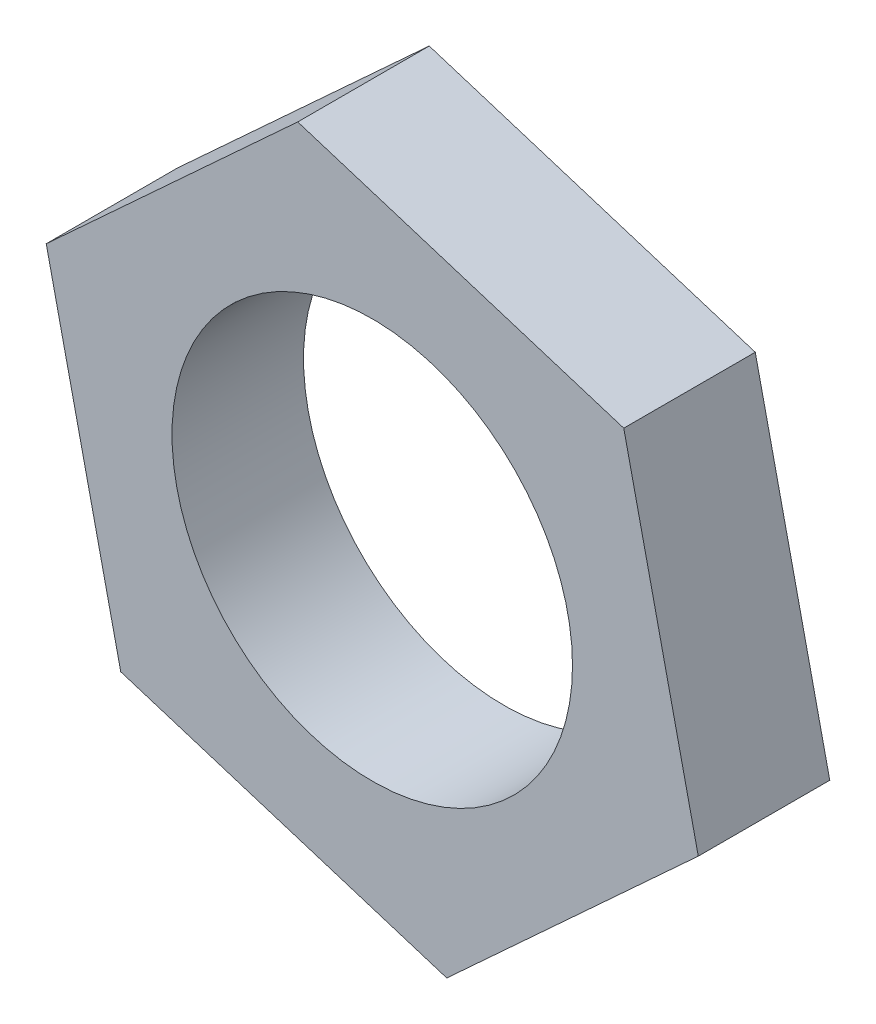
ISO-10303-21;
HEADER;
FILE_DESCRIPTION(('STEP AP214'),'2;1');
FILE_NAME('part.step','',(''),(''),'','','');
FILE_SCHEMA(('AUTOMOTIVE_DESIGN { 1 0 10303 214 1 1 1 1 }'));
ENDSEC;
DATA;
#1=APPLICATION_CONTEXT('core data for automotive mechanical design processes');
#2=APPLICATION_PROTOCOL_DEFINITION('international standard','automotive_design',2000,#1);
#3=PRODUCT_CONTEXT('',#1,'mechanical');
#4=PRODUCT('Part','Part','',(#3));
#5=PRODUCT_RELATED_PRODUCT_CATEGORY('part','',(#4));
#6=PRODUCT_DEFINITION_FORMATION('','',#4);
#7=PRODUCT_DEFINITION_CONTEXT('part definition',#1,'design');
#8=PRODUCT_DEFINITION('design','',#6,#7);
#9=PRODUCT_DEFINITION_SHAPE('','',#8);
#10=(LENGTH_UNIT() NAMED_UNIT(*) SI_UNIT(.MILLI.,.METRE.));
#11=(NAMED_UNIT(*) PLANE_ANGLE_UNIT() SI_UNIT($,.RADIAN.));
#12=(NAMED_UNIT(*) SI_UNIT($,.STERADIAN.) SOLID_ANGLE_UNIT());
#13=UNCERTAINTY_MEASURE_WITH_UNIT(LENGTH_MEASURE(1.E-05),#10,'distance_accuracy_value','');
#14=(GEOMETRIC_REPRESENTATION_CONTEXT(3) GLOBAL_UNCERTAINTY_ASSIGNED_CONTEXT((#13)) GLOBAL_UNIT_ASSIGNED_CONTEXT((#10,
#11,#12)) REPRESENTATION_CONTEXT('',''));
#15=CARTESIAN_POINT('',(0.,0.,0.));
#16=DIRECTION('',(0.,0.,1.));
#17=DIRECTION('',(1.,0.,0.));
#18=AXIS2_PLACEMENT_3D('',#15,#16,#17);
#19=CARTESIAN_POINT('',(0.,0.,2.2));
#20=DIRECTION('',(0.,0.,1.));
#21=DIRECTION('',(1.,0.,0.));
#22=AXIS2_PLACEMENT_3D('',#19,#20,#21);
#23=PLANE('',#22);
#24=DIRECTION('',(-0.218097220754166,0.975927047631793,0.));
#25=VECTOR('',#24,1.);
#26=CARTESIAN_POINT('',(5.45413540688142,-1.70950488838216,2.2));
#27=LINE('',#26,#25);
#28=CARTESIAN_POINT('',(5.45413540688142,-1.70950488838216,2.2));
#29=VERTEX_POINT('',#28);
#30=CARTESIAN_POINT('',(4.20754236467334,3.8686673738484,2.2));
#31=VERTEX_POINT('',#30);
#32=EDGE_CURVE('E137',#29,#31,#27,.T.);
#33=ORIENTED_EDGE('',*,*,#32,.T.);
#34=DIRECTION('',(-0.954226225866562,0.299085790148007,0.));
#35=VECTOR('',#34,1.);
#36=CARTESIAN_POINT('',(4.20754236467334,3.8686673738484,2.2));
#37=LINE('',#36,#35);
#38=CARTESIAN_POINT('',(-1.24659304220807,5.57817226223056,2.2));
#39=VERTEX_POINT('',#38);
#40=EDGE_CURVE('E95',#31,#39,#37,.T.);
#41=ORIENTED_EDGE('',*,*,#40,.T.);
#42=DIRECTION('',(-0.736129005112396,-0.676841257483787,0.));
#43=VECTOR('',#42,1.);
#44=CARTESIAN_POINT('',(-1.24659304220807,5.57817226223056,2.2));
#45=LINE('',#44,#43);
#46=CARTESIAN_POINT('',(-5.45413540688141,1.70950488838216,2.2));
#47=VERTEX_POINT('',#46);
#48=EDGE_CURVE('E108',#39,#47,#45,.T.);
#49=ORIENTED_EDGE('',*,*,#48,.T.);
#50=DIRECTION('',(0.218097220754166,-0.975927047631793,0.));
#51=VECTOR('',#50,1.);
#52=CARTESIAN_POINT('',(-5.45413540688141,1.70950488838216,2.2));
#53=LINE('',#52,#51);
#54=CARTESIAN_POINT('',(-4.20754236467334,-3.8686673738484,2.2));
#55=VERTEX_POINT('',#54);
#56=EDGE_CURVE('E102',#47,#55,#53,.T.);
#57=ORIENTED_EDGE('',*,*,#56,.T.);
#58=DIRECTION('',(0.954226225866562,-0.299085790148007,0.));
#59=VECTOR('',#58,1.);
#60=CARTESIAN_POINT('',(-4.20754236467334,-3.8686673738484,2.2));
#61=LINE('',#60,#59);
#62=CARTESIAN_POINT('',(1.24659304220808,-5.57817226223056,2.2));
#63=VERTEX_POINT('',#62);
#64=EDGE_CURVE('E106',#55,#63,#61,.T.);
#65=ORIENTED_EDGE('',*,*,#64,.T.);
#66=DIRECTION('',(0.736129005112396,0.676841257483787,0.));
#67=VECTOR('',#66,1.);
#68=CARTESIAN_POINT('',(1.24659304220808,-5.57817226223056,2.2));
#69=LINE('',#68,#67);
#70=EDGE_CURVE('E58',#63,#29,#69,.T.);
#71=ORIENTED_EDGE('',*,*,#70,.T.);
#72=EDGE_LOOP('',(#33,#41,#49,#57,#65,#71));
#73=FACE_BOUND('',#72,.T.);
#74=CARTESIAN_POINT('',(0.,0.,2.2));
#75=DIRECTION('',(0.,0.,1.));
#76=DIRECTION('',(1.,0.,0.));
#77=AXIS2_PLACEMENT_3D('',#74,#75,#76);
#78=CIRCLE('',#77,3.35);
#79=CARTESIAN_POINT('',(3.35,0.,2.2));
#80=VERTEX_POINT('',#79);
#81=EDGE_CURVE('E130',#80,#80,#78,.T.);
#82=ORIENTED_EDGE('',*,*,#81,.F.);
#83=EDGE_LOOP('',(#82));
#84=FACE_BOUND('',#83,.T.);
#85=ADVANCED_FACE('F41',(#73,#84),#23,.T.);
#86=CARTESIAN_POINT('',(0.,0.,0.));
#87=DIRECTION('',(0.,0.,1.));
#88=DIRECTION('',(1.,0.,0.));
#89=AXIS2_PLACEMENT_3D('',#86,#87,#88);
#90=PLANE('',#89);
#91=DIRECTION('',(-0.218097220754166,0.975927047631793,0.));
#92=VECTOR('',#91,1.);
#93=CARTESIAN_POINT('',(5.45413540688142,-1.70950488838216,0.));
#94=LINE('',#93,#92);
#95=CARTESIAN_POINT('',(5.45413540688142,-1.70950488838216,0.));
#96=VERTEX_POINT('',#95);
#97=CARTESIAN_POINT('',(4.20754236467334,3.8686673738484,0.));
#98=VERTEX_POINT('',#97);
#99=EDGE_CURVE('E126',#96,#98,#94,.T.);
#100=ORIENTED_EDGE('',*,*,#99,.F.);
#101=DIRECTION('',(0.736129005112396,0.676841257483787,0.));
#102=VECTOR('',#101,1.);
#103=CARTESIAN_POINT('',(1.24659304220808,-5.57817226223056,0.));
#104=LINE('',#103,#102);
#105=CARTESIAN_POINT('',(1.24659304220808,-5.57817226223056,0.));
#106=VERTEX_POINT('',#105);
#107=EDGE_CURVE('E87',#106,#96,#104,.T.);
#108=ORIENTED_EDGE('',*,*,#107,.F.);
#109=DIRECTION('',(0.954226225866562,-0.299085790148007,0.));
#110=VECTOR('',#109,1.);
#111=CARTESIAN_POINT('',(-4.20754236467334,-3.8686673738484,0.));
#112=LINE('',#111,#110);
#113=CARTESIAN_POINT('',(-4.20754236467334,-3.8686673738484,0.));
#114=VERTEX_POINT('',#113);
#115=EDGE_CURVE('E81',#114,#106,#112,.T.);
#116=ORIENTED_EDGE('',*,*,#115,.F.);
#117=DIRECTION('',(0.218097220754166,-0.975927047631793,0.));
#118=VECTOR('',#117,1.);
#119=CARTESIAN_POINT('',(-5.45413540688141,1.70950488838216,0.));
#120=LINE('',#119,#118);
#121=CARTESIAN_POINT('',(-5.45413540688141,1.70950488838216,0.));
#122=VERTEX_POINT('',#121);
#123=EDGE_CURVE('E116',#122,#114,#120,.T.);
#124=ORIENTED_EDGE('',*,*,#123,.F.);
#125=DIRECTION('',(-0.736129005112396,-0.676841257483787,0.));
#126=VECTOR('',#125,1.);
#127=CARTESIAN_POINT('',(-1.24659304220807,5.57817226223056,0.));
#128=LINE('',#127,#126);
#129=CARTESIAN_POINT('',(-1.24659304220807,5.57817226223056,0.));
#130=VERTEX_POINT('',#129);
#131=EDGE_CURVE('E132',#130,#122,#128,.T.);
#132=ORIENTED_EDGE('',*,*,#131,.F.);
#133=DIRECTION('',(-0.954226225866562,0.299085790148007,0.));
#134=VECTOR('',#133,1.);
#135=CARTESIAN_POINT('',(4.20754236467334,3.8686673738484,0.));
#136=LINE('',#135,#134);
#137=EDGE_CURVE('E129',#98,#130,#136,.T.);
#138=ORIENTED_EDGE('',*,*,#137,.F.);
#139=EDGE_LOOP('',(#100,#108,#116,#124,#132,#138));
#140=FACE_BOUND('',#139,.T.);
#141=CARTESIAN_POINT('',(0.,0.,0.));
#142=DIRECTION('',(0.,0.,1.));
#143=DIRECTION('',(1.,0.,0.));
#144=AXIS2_PLACEMENT_3D('',#141,#142,#143);
#145=CIRCLE('',#144,3.35);
#146=CARTESIAN_POINT('',(3.35,0.,0.));
#147=VERTEX_POINT('',#146);
#148=EDGE_CURVE('E236',#147,#147,#145,.T.);
#149=ORIENTED_EDGE('',*,*,#148,.T.);
#150=EDGE_LOOP('',(#149));
#151=FACE_BOUND('',#150,.T.);
#152=ADVANCED_FACE('F146',(#140,#151),#90,.F.);
#153=CARTESIAN_POINT('',(5.45413540688142,-1.70950488838216,2.2));
#154=DIRECTION('',(-0.975927047631793,-0.218097220754166,0.));
#155=DIRECTION('',(0.218097220754166,-0.975927047631793,0.));
#156=AXIS2_PLACEMENT_3D('',#153,#154,#155);
#157=PLANE('',#156);
#158=ORIENTED_EDGE('',*,*,#99,.T.);
#159=DIRECTION('',(0.,0.,-1.));
#160=VECTOR('',#159,1.);
#161=CARTESIAN_POINT('',(4.20754236467334,3.8686673738484,2.2));
#162=LINE('',#161,#160);
#163=EDGE_CURVE('E11',#31,#98,#162,.T.);
#164=ORIENTED_EDGE('',*,*,#163,.F.);
#165=ORIENTED_EDGE('',*,*,#32,.F.);
#166=DIRECTION('',(0.,0.,-1.));
#167=VECTOR('',#166,1.);
#168=CARTESIAN_POINT('',(5.45413540688142,-1.70950488838216,2.2));
#169=LINE('',#168,#167);
#170=EDGE_CURVE('E122',#29,#96,#169,.T.);
#171=ORIENTED_EDGE('',*,*,#170,.T.);
#172=EDGE_LOOP('',(#158,#164,#165,#171));
#173=FACE_BOUND('',#172,.T.);
#174=ADVANCED_FACE('F43',(#173),#157,.F.);
#175=CARTESIAN_POINT('',(4.20754236467334,3.8686673738484,2.2));
#176=DIRECTION('',(-0.299085790148007,-0.954226225866562,0.));
#177=DIRECTION('',(0.954226225866562,-0.299085790148007,0.));
#178=AXIS2_PLACEMENT_3D('',#175,#176,#177);
#179=PLANE('',#178);
#180=ORIENTED_EDGE('',*,*,#137,.T.);
#181=DIRECTION('',(0.,0.,-1.));
#182=VECTOR('',#181,1.);
#183=CARTESIAN_POINT('',(-1.24659304220807,5.57817226223056,2.2));
#184=LINE('',#183,#182);
#185=EDGE_CURVE('E50',#39,#130,#184,.T.);
#186=ORIENTED_EDGE('',*,*,#185,.F.);
#187=ORIENTED_EDGE('',*,*,#40,.F.);
#188=ORIENTED_EDGE('',*,*,#163,.T.);
#189=EDGE_LOOP('',(#180,#186,#187,#188));
#190=FACE_BOUND('',#189,.T.);
#191=ADVANCED_FACE('F171',(#190),#179,.F.);
#192=CARTESIAN_POINT('',(-1.24659304220807,5.57817226223056,2.2));
#193=DIRECTION('',(0.676841257483787,-0.736129005112396,0.));
#194=DIRECTION('',(0.736129005112396,0.676841257483787,0.));
#195=AXIS2_PLACEMENT_3D('',#192,#193,#194);
#196=PLANE('',#195);
#197=ORIENTED_EDGE('',*,*,#131,.T.);
#198=DIRECTION('',(0.,0.,-1.));
#199=VECTOR('',#198,1.);
#200=CARTESIAN_POINT('',(-5.45413540688141,1.70950488838216,2.2));
#201=LINE('',#200,#199);
#202=EDGE_CURVE('E117',#47,#122,#201,.T.);
#203=ORIENTED_EDGE('',*,*,#202,.F.);
#204=ORIENTED_EDGE('',*,*,#48,.F.);
#205=ORIENTED_EDGE('',*,*,#185,.T.);
#206=EDGE_LOOP('',(#197,#203,#204,#205));
#207=FACE_BOUND('',#206,.T.);
#208=ADVANCED_FACE('F143',(#207),#196,.F.);
#209=CARTESIAN_POINT('',(-5.45413540688141,1.70950488838216,2.2));
#210=DIRECTION('',(0.975927047631793,0.218097220754166,0.));
#211=DIRECTION('',(-0.218097220754166,0.975927047631793,0.));
#212=AXIS2_PLACEMENT_3D('',#209,#210,#211);
#213=PLANE('',#212);
#214=ORIENTED_EDGE('',*,*,#123,.T.);
#215=DIRECTION('',(0.,0.,-1.));
#216=VECTOR('',#215,1.);
#217=CARTESIAN_POINT('',(-4.20754236467334,-3.8686673738484,2.2));
#218=LINE('',#217,#216);
#219=EDGE_CURVE('E113',#55,#114,#218,.T.);
#220=ORIENTED_EDGE('',*,*,#219,.F.);
#221=ORIENTED_EDGE('',*,*,#56,.F.);
#222=ORIENTED_EDGE('',*,*,#202,.T.);
#223=EDGE_LOOP('',(#214,#220,#221,#222));
#224=FACE_BOUND('',#223,.T.);
#225=ADVANCED_FACE('F114',(#224),#213,.F.);
#226=CARTESIAN_POINT('',(-4.20754236467334,-3.8686673738484,2.2));
#227=DIRECTION('',(0.299085790148007,0.954226225866562,0.));
#228=DIRECTION('',(-0.954226225866562,0.299085790148007,0.));
#229=AXIS2_PLACEMENT_3D('',#226,#227,#228);
#230=PLANE('',#229);
#231=ORIENTED_EDGE('',*,*,#115,.T.);
#232=DIRECTION('',(0.,0.,-1.));
#233=VECTOR('',#232,1.);
#234=CARTESIAN_POINT('',(1.24659304220808,-5.57817226223056,2.2));
#235=LINE('',#234,#233);
#236=EDGE_CURVE('E118',#63,#106,#235,.T.);
#237=ORIENTED_EDGE('',*,*,#236,.F.);
#238=ORIENTED_EDGE('',*,*,#64,.F.);
#239=ORIENTED_EDGE('',*,*,#219,.T.);
#240=EDGE_LOOP('',(#231,#237,#238,#239));
#241=FACE_BOUND('',#240,.T.);
#242=ADVANCED_FACE('F120',(#241),#230,.F.);
#243=CARTESIAN_POINT('',(1.24659304220808,-5.57817226223056,2.2));
#244=DIRECTION('',(-0.676841257483787,0.736129005112396,0.));
#245=DIRECTION('',(-0.736129005112396,-0.676841257483787,0.));
#246=AXIS2_PLACEMENT_3D('',#243,#244,#245);
#247=PLANE('',#246);
#248=ORIENTED_EDGE('',*,*,#107,.T.);
#249=ORIENTED_EDGE('',*,*,#170,.F.);
#250=ORIENTED_EDGE('',*,*,#70,.F.);
#251=ORIENTED_EDGE('',*,*,#236,.T.);
#252=EDGE_LOOP('',(#248,#249,#250,#251));
#253=FACE_BOUND('',#252,.T.);
#254=ADVANCED_FACE('F151',(#253),#247,.F.);
#255=CARTESIAN_POINT('',(0.,0.,2.2));
#256=DIRECTION('',(0.,0.,-1.));
#257=DIRECTION('',(-1.,0.,0.));
#258=AXIS2_PLACEMENT_3D('',#255,#256,#257);
#259=CYLINDRICAL_SURFACE('',#258,3.35);
#260=ORIENTED_EDGE('',*,*,#81,.T.);
#261=EDGE_LOOP('',(#260));
#262=FACE_BOUND('',#261,.T.);
#263=ORIENTED_EDGE('',*,*,#148,.F.);
#264=EDGE_LOOP('',(#263));
#265=FACE_BOUND('',#264,.T.);
#266=ADVANCED_FACE('F153',(#262,#265),#259,.F.);
#267=CLOSED_SHELL('',(#85,#152,#174,#191,#208,#225,#242,#254,#266));
#268=MANIFOLD_SOLID_BREP('B2',#267);
#269=ADVANCED_BREP_SHAPE_REPRESENTATION('',(#18,#268),#14);
#270=SHAPE_DEFINITION_REPRESENTATION(#9,#269);
ENDSEC;
END-ISO-10303-21;
